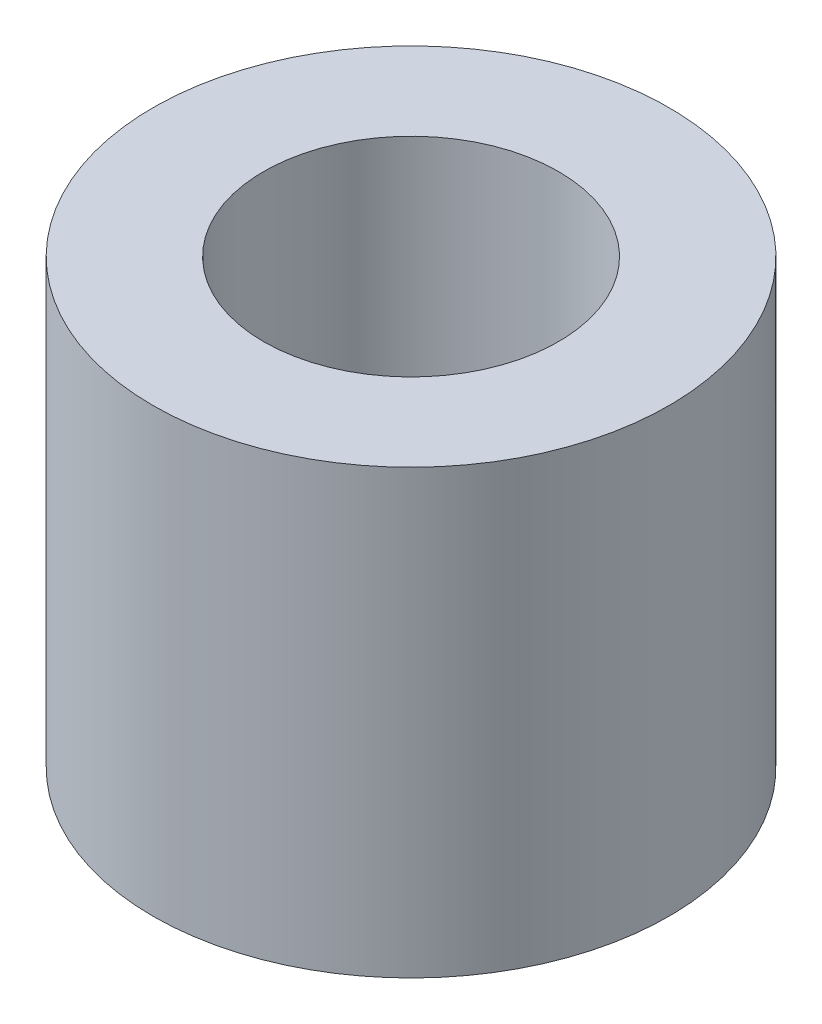
ISO-10303-21;
HEADER;
FILE_DESCRIPTION(('STEP AP214'),'2;1');
FILE_NAME('part.step','',(''),(''),'','','');
FILE_SCHEMA(('AUTOMOTIVE_DESIGN { 1 0 10303 214 1 1 1 1 }'));
ENDSEC;
DATA;
#1=APPLICATION_CONTEXT('core data for automotive mechanical design processes');
#2=APPLICATION_PROTOCOL_DEFINITION('international standard','automotive_design',2000,#1);
#3=PRODUCT_CONTEXT('',#1,'mechanical');
#4=PRODUCT('Part','Part','',(#3));
#5=PRODUCT_RELATED_PRODUCT_CATEGORY('part','',(#4));
#6=PRODUCT_DEFINITION_FORMATION('','',#4);
#7=PRODUCT_DEFINITION_CONTEXT('part definition',#1,'design');
#8=PRODUCT_DEFINITION('design','',#6,#7);
#9=PRODUCT_DEFINITION_SHAPE('','',#8);
#10=(LENGTH_UNIT() NAMED_UNIT(*) SI_UNIT(.MILLI.,.METRE.));
#11=(NAMED_UNIT(*) PLANE_ANGLE_UNIT() SI_UNIT($,.RADIAN.));
#12=(NAMED_UNIT(*) SI_UNIT($,.STERADIAN.) SOLID_ANGLE_UNIT());
#13=UNCERTAINTY_MEASURE_WITH_UNIT(LENGTH_MEASURE(1.E-05),#10,'distance_accuracy_value','');
#14=(GEOMETRIC_REPRESENTATION_CONTEXT(3) GLOBAL_UNCERTAINTY_ASSIGNED_CONTEXT((#13)) GLOBAL_UNIT_ASSIGNED_CONTEXT((#10,
#11,#12)) REPRESENTATION_CONTEXT('',''));
#15=CARTESIAN_POINT('',(0.,0.,0.));
#16=DIRECTION('',(0.,0.,1.));
#17=DIRECTION('',(1.,0.,0.));
#18=AXIS2_PLACEMENT_3D('',#15,#16,#17);
#19=CARTESIAN_POINT('',(0.,3.,0.));
#20=DIRECTION('',(0.,1.,0.));
#21=DIRECTION('',(0.,0.,1.));
#22=AXIS2_PLACEMENT_3D('',#19,#20,#21);
#23=PLANE('',#22);
#24=CARTESIAN_POINT('',(0.,3.,0.));
#25=DIRECTION('',(0.,1.,0.));
#26=DIRECTION('',(0.,0.,1.));
#27=AXIS2_PLACEMENT_3D('',#24,#25,#26);
#28=CIRCLE('',#27,1.75);
#29=CARTESIAN_POINT('',(0.,3.,1.75));
#30=VERTEX_POINT('',#29);
#31=EDGE_CURVE('E10',#30,#30,#28,.T.);
#32=ORIENTED_EDGE('',*,*,#31,.T.);
#33=EDGE_LOOP('',(#32));
#34=FACE_BOUND('',#33,.T.);
#35=CARTESIAN_POINT('',(0.,3.,0.));
#36=DIRECTION('',(0.,1.,0.));
#37=DIRECTION('',(0.,0.,1.));
#38=AXIS2_PLACEMENT_3D('',#35,#36,#37);
#39=CIRCLE('',#38,1.);
#40=CARTESIAN_POINT('',(0.,3.,1.));
#41=VERTEX_POINT('',#40);
#42=EDGE_CURVE('E50',#41,#41,#39,.T.);
#43=ORIENTED_EDGE('',*,*,#42,.F.);
#44=EDGE_LOOP('',(#43));
#45=FACE_BOUND('',#44,.T.);
#46=ADVANCED_FACE('F37',(#34,#45),#23,.T.);
#47=CARTESIAN_POINT('',(0.,0.,0.));
#48=DIRECTION('',(0.,1.,0.));
#49=DIRECTION('',(0.,0.,1.));
#50=AXIS2_PLACEMENT_3D('',#47,#48,#49);
#51=PLANE('',#50);
#52=CARTESIAN_POINT('',(0.,0.,0.));
#53=DIRECTION('',(0.,1.,0.));
#54=DIRECTION('',(0.,0.,1.));
#55=AXIS2_PLACEMENT_3D('',#52,#53,#54);
#56=CIRCLE('',#55,1.75);
#57=CARTESIAN_POINT('',(0.,0.,1.75));
#58=VERTEX_POINT('',#57);
#59=EDGE_CURVE('E41',#58,#58,#56,.T.);
#60=ORIENTED_EDGE('',*,*,#59,.F.);
#61=EDGE_LOOP('',(#60));
#62=FACE_BOUND('',#61,.T.);
#63=CARTESIAN_POINT('',(0.,0.,0.));
#64=DIRECTION('',(0.,1.,0.));
#65=DIRECTION('',(0.,0.,1.));
#66=AXIS2_PLACEMENT_3D('',#63,#64,#65);
#67=CIRCLE('',#66,1.);
#68=CARTESIAN_POINT('',(0.,0.,1.));
#69=VERTEX_POINT('',#68);
#70=EDGE_CURVE('E52',#69,#69,#67,.T.);
#71=ORIENTED_EDGE('',*,*,#70,.T.);
#72=EDGE_LOOP('',(#71));
#73=FACE_BOUND('',#72,.T.);
#74=ADVANCED_FACE('F64',(#62,#73),#51,.F.);
#75=CARTESIAN_POINT('',(0.,3.,0.));
#76=DIRECTION('',(0.,-1.,0.));
#77=DIRECTION('',(0.,0.,-1.));
#78=AXIS2_PLACEMENT_3D('',#75,#76,#77);
#79=CYLINDRICAL_SURFACE('',#78,1.75);
#80=ORIENTED_EDGE('',*,*,#31,.F.);
#81=EDGE_LOOP('',(#80));
#82=FACE_BOUND('',#81,.T.);
#83=ORIENTED_EDGE('',*,*,#59,.T.);
#84=EDGE_LOOP('',(#83));
#85=FACE_BOUND('',#84,.T.);
#86=ADVANCED_FACE('F39',(#82,#85),#79,.T.);
#87=CARTESIAN_POINT('',(0.,3.,0.));
#88=DIRECTION('',(0.,-1.,0.));
#89=DIRECTION('',(0.,0.,-1.));
#90=AXIS2_PLACEMENT_3D('',#87,#88,#89);
#91=CYLINDRICAL_SURFACE('',#90,1.);
#92=ORIENTED_EDGE('',*,*,#42,.T.);
#93=EDGE_LOOP('',(#92));
#94=FACE_BOUND('',#93,.T.);
#95=ORIENTED_EDGE('',*,*,#70,.F.);
#96=EDGE_LOOP('',(#95));
#97=FACE_BOUND('',#96,.T.);
#98=ADVANCED_FACE('F60',(#94,#97),#91,.F.);
#99=CLOSED_SHELL('',(#46,#74,#86,#98));
#100=MANIFOLD_SOLID_BREP('B2',#99);
#101=ADVANCED_BREP_SHAPE_REPRESENTATION('',(#18,#100),#14);
#102=SHAPE_DEFINITION_REPRESENTATION(#9,#101);
ENDSEC;
END-ISO-10303-21;
